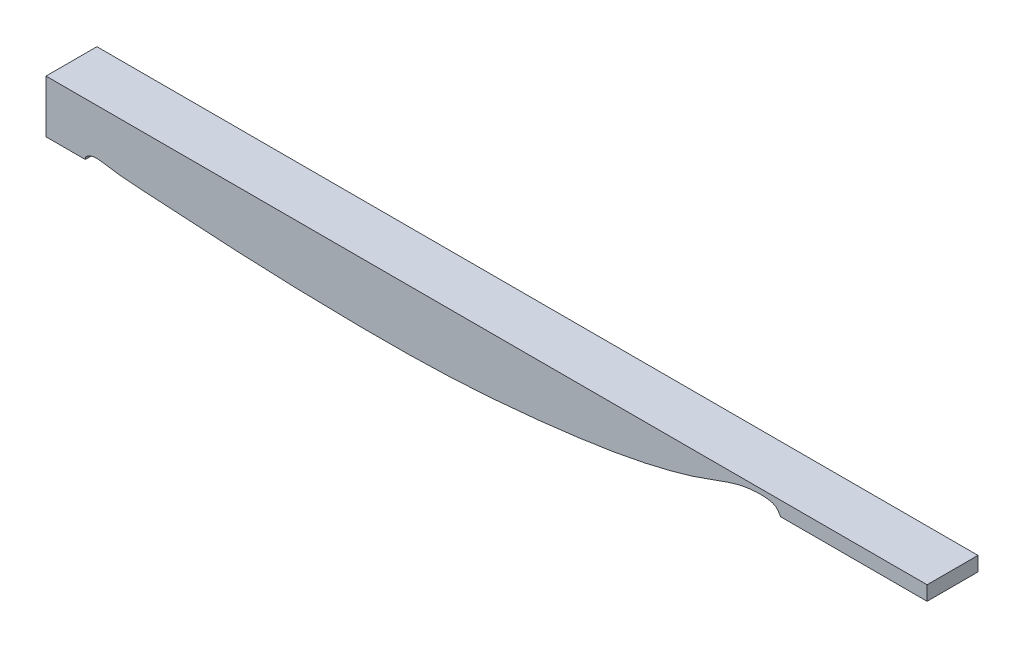
ISO-10303-21;
HEADER;
FILE_DESCRIPTION(('STEP AP214'),'2;1');
FILE_NAME('part.step','',(''),(''),'','','');
FILE_SCHEMA(('AUTOMOTIVE_DESIGN { 1 0 10303 214 1 1 1 1 }'));
ENDSEC;
DATA;
#1=APPLICATION_CONTEXT('core data for automotive mechanical design processes');
#2=APPLICATION_PROTOCOL_DEFINITION('international standard','automotive_design',2000,#1);
#3=PRODUCT_CONTEXT('',#1,'mechanical');
#4=PRODUCT('Part','Part','',(#3));
#5=PRODUCT_RELATED_PRODUCT_CATEGORY('part','',(#4));
#6=PRODUCT_DEFINITION_FORMATION('','',#4);
#7=PRODUCT_DEFINITION_CONTEXT('part definition',#1,'design');
#8=PRODUCT_DEFINITION('design','',#6,#7);
#9=PRODUCT_DEFINITION_SHAPE('','',#8);
#10=(LENGTH_UNIT() NAMED_UNIT(*) SI_UNIT(.MILLI.,.METRE.));
#11=(NAMED_UNIT(*) PLANE_ANGLE_UNIT() SI_UNIT($,.RADIAN.));
#12=(NAMED_UNIT(*) SI_UNIT($,.STERADIAN.) SOLID_ANGLE_UNIT());
#13=UNCERTAINTY_MEASURE_WITH_UNIT(LENGTH_MEASURE(1.E-05),#10,'distance_accuracy_value','');
#14=(GEOMETRIC_REPRESENTATION_CONTEXT(3) GLOBAL_UNCERTAINTY_ASSIGNED_CONTEXT((#13)) GLOBAL_UNIT_ASSIGNED_CONTEXT((#10,
#11,#12)) REPRESENTATION_CONTEXT('',''));
#15=CARTESIAN_POINT('',(0.,0.,0.));
#16=DIRECTION('',(0.,0.,1.));
#17=DIRECTION('',(1.,0.,0.));
#18=AXIS2_PLACEMENT_3D('',#15,#16,#17);
#19=CARTESIAN_POINT('',(-72.4217622520044,-6.0152528860404,492.));
#20=CARTESIAN_POINT('',(-72.4245340695074,-5.9419574405548,492.));
#21=CARTESIAN_POINT('',(-72.4264209550801,-5.86849221554323,492.));
#22=CARTESIAN_POINT('',(-72.4014484345056,-5.72434678750431,492.));
#23=CARTESIAN_POINT('',(-72.3745394573664,-5.65468478352478,492.));
#24=CARTESIAN_POINT('',(-72.2910639726507,-5.53221105076504,492.));
#25=CARTESIAN_POINT('',(-72.2346892942378,-5.48434236688133,492.));
#26=CARTESIAN_POINT('',(-72.1111212949632,-5.40440756269998,492.));
#27=CARTESIAN_POINT('',(-72.0465932612626,-5.36897528484742,492.));
#28=CARTESIAN_POINT('',(-71.854598746897,-5.26005130703209,492.));
#29=CARTESIAN_POINT('',(-71.724051366403,-5.19331466939612,492.));
#30=CARTESIAN_POINT('',(-71.4543296582812,-5.07982734814863,492.));
#31=CARTESIAN_POINT('',(-71.3122105257513,-5.03478950164715,492.));
#32=CARTESIAN_POINT('',(-70.8828234986377,-4.94984975591808,492.));
#33=CARTESIAN_POINT('',(-70.5960984017313,-4.9498880499188,492.));
#34=CARTESIAN_POINT('',(-70.0223188965501,-4.98991583819331,492.));
#35=CARTESIAN_POINT('',(-69.7348556998785,-5.02990828965604,492.));
#36=CARTESIAN_POINT('',(-69.1630808790653,-5.12321939807267,492.));
#37=CARTESIAN_POINT('',(-68.8782592831821,-5.17709029341441,492.));
#38=CARTESIAN_POINT('',(-68.3068091313997,-5.27259934318085,492.));
#39=CARTESIAN_POINT('',(-68.0204179730074,-5.31584462901445,492.));
#40=CARTESIAN_POINT('',(-67.1591286229369,-5.43125645656597,492.));
#41=CARTESIAN_POINT('',(-66.5818368718395,-5.48846860570867,492.));
#42=CARTESIAN_POINT('',(-65.4266985136911,-5.5830156976732,492.));
#43=CARTESIAN_POINT('',(-64.8485015239191,-5.62099238073446,492.));
#44=CARTESIAN_POINT('',(-63.6920746117483,-5.69645806781939,492.));
#45=CARTESIAN_POINT('',(-63.113887936377,-5.7345874905034,492.));
#46=CARTESIAN_POINT('',(-61.3791070923542,-5.84570580180726,492.));
#47=CARTESIAN_POINT('',(-60.2223035787287,-5.91559462931925,492.));
#48=CARTESIAN_POINT('',(-56.7518246475243,-6.12424836150641,492.));
#49=CARTESIAN_POINT('',(-54.4379833497714,-6.26043871454947,492.));
#50=CARTESIAN_POINT('',(-49.8094822127769,-6.51801853356771,492.));
#51=CARTESIAN_POINT('',(-47.4946815971044,-6.63755447555274,492.));
#52=CARTESIAN_POINT('',(-42.8635944178189,-6.84013750742366,492.));
#53=CARTESIAN_POINT('',(-40.5471259736763,-6.92366254378774,492.));
#54=CARTESIAN_POINT('',(-35.9135695608005,-7.05170215727384,492.));
#55=CARTESIAN_POINT('',(-33.596509431796,-7.09638295300983,492.));
#56=CARTESIAN_POINT('',(-28.9619520973505,-7.15576246070778,492.));
#57=CARTESIAN_POINT('',(-26.6444588078629,-7.17072979488286,492.));
#58=CARTESIAN_POINT('',(-22.0087638801482,-7.15207394339982,492.));
#59=CARTESIAN_POINT('',(-19.6913061972212,-7.11765540365621,492.));
#60=CARTESIAN_POINT('',(-15.0582313976797,-6.96755312195935,492.));
#61=CARTESIAN_POINT('',(-12.7432996489547,-6.85041466424149,492.));
#62=CARTESIAN_POINT('',(-8.12123285731955,-6.53520933522524,492.));
#63=CARTESIAN_POINT('',(-5.81322487028038,-6.33938113813548,492.));
#64=CARTESIAN_POINT('',(-1.2019211917164,-5.88818568034258,492.));
#65=CARTESIAN_POINT('',(1.10191710145064,-5.63235666258094,492.));
#66=CARTESIAN_POINT('',(5.69961502766229,-5.0493858193213,492.));
#67=CARTESIAN_POINT('',(7.99487576209379,-4.72380334110932,492.));
#68=CARTESIAN_POINT('',(11.423136267596,-4.15250706058942,492.));
#69=CARTESIAN_POINT('',(12.5632073579957,-3.94776266426388,492.));
#70=CARTESIAN_POINT('',(14.836341266982,-3.50088046240673,492.));
#71=CARTESIAN_POINT('',(15.9696675090794,-3.25806016741816,492.));
#72=CARTESIAN_POINT('',(18.2274484345349,-2.7346839421168,492.));
#73=CARTESIAN_POINT('',(19.3513767247218,-2.45516415681807,492.));
#74=CARTESIAN_POINT('',(21.5854278551139,-1.84651440785487,492.));
#75=CARTESIAN_POINT('',(22.6954179773851,-1.5169075194695,492.));
#76=CARTESIAN_POINT('',(24.3447899368817,-0.966390734433868,492.));
#77=CARTESIAN_POINT('',(24.8920239934532,-0.773677168587686,492.));
#78=CARTESIAN_POINT('',(25.983575205103,-0.378537214421157,492.));
#79=CARTESIAN_POINT('',(26.5275230015819,-0.174714314122803,492.));
#80=CARTESIAN_POINT('',(28.161663014074,0.428897655077978,492.));
#81=CARTESIAN_POINT('',(29.2548591175684,0.818410445544518,492.));
#82=CARTESIAN_POINT('',(30.9490466219192,1.21660035763408,492.));
#83=CARTESIAN_POINT('',(31.5233101668211,1.31671329085222,492.));
#84=CARTESIAN_POINT('',(32.6916562728048,1.44913843909731,492.));
#85=CARTESIAN_POINT('',(33.2825186784819,1.48267812700992,492.));
#86=CARTESIAN_POINT('',(34.1624821737295,1.46840272465559,492.));
#87=CARTESIAN_POINT('',(34.4555294847842,1.45334470995123,492.));
#88=CARTESIAN_POINT('',(34.8942287747826,1.39797425858455,492.));
#89=CARTESIAN_POINT('',(35.040500378108,1.37415878937688,492.));
#90=CARTESIAN_POINT('',(35.3319523256912,1.31379050654007,492.));
#91=CARTESIAN_POINT('',(35.4754991104092,1.27703119693708,492.));
#92=CARTESIAN_POINT('',(35.7547907564674,1.17997218878709,492.));
#93=CARTESIAN_POINT('',(35.8925878135417,1.11798020387173,492.));
#94=CARTESIAN_POINT('',(36.1415595906588,0.956820966047689,492.));
#95=CARTESIAN_POINT('',(36.2499148066927,0.855692868396349,492.));
#96=CARTESIAN_POINT('',(36.4466254523518,0.630516659071787,492.));
#97=CARTESIAN_POINT('',(36.5323595702494,0.508516224467772,492.));
#98=CARTESIAN_POINT('',(36.6664626506569,0.329618646071986,492.));
#99=CARTESIAN_POINT('',(36.7114348362996,0.270188338070849,492.));
#100=CARTESIAN_POINT('',(36.7904192551986,0.143154279947842,492.));
#101=CARTESIAN_POINT('',(36.8221023787594,0.074955100419384,492.));
#102=CARTESIAN_POINT('',(36.8321008981339,0.,492.));
#103=B_SPLINE_CURVE_WITH_KNOTS('',3,(#19,#20,#21,#22,#23,#24,#25,#26,#27,#28,#29,#30,#31,#32,
#33,#34,#35,#36,#37,#38,#39,#40,#41,#42,#43,#44,#45,#46,#47,#48,#49,#50,#51,#52,#53,#54,#55,#56,
#57,#58,#59,#60,#61,#62,#63,#64,#65,#66,#67,#68,#69,#70,#71,#72,#73,#74,#75,#76,#77,#78,#79,#80,
#81,#82,#83,#84,#85,#86,#87,#88,#89,#90,#91,#92,#93,#94,#95,#96,#97,#98,#99,#100,#101,#102),
.UNSPECIFIED.,.F.,.F.,(4,2,2,2,2,2,2,2,2,2,2,2,2,2,2,2,2,2,2,2,2,2,2,2,2,2,2,2,2,2,2,2,2,2,2,2,
2,2,2,2,2,4),(0.,0.00195312500000011,0.00390625000000033,0.00585937500000044,
0.00781250000000067,0.0117187500000007,0.0156250000000007,0.0234375000000007,0.0312500000000007,
0.0390625000000007,0.0468750000000007,0.0625000000000007,0.0781250000000007,0.0937500000000006,
0.125,0.1875,0.25,0.3125,0.375,0.4375,0.5,0.5625,0.625,0.6875,0.75,0.78125,0.8125,0.84375,0.875,
0.890625,0.90625,0.9375,0.953124999999999,0.968749999999999,0.976562499999999,0.980468749999999,
0.984375,0.98828125,0.9921875,0.99609375,0.998046875,1.),.UNSPECIFIED.);
#104=DIRECTION('',(0.,0.,-1.));
#105=VECTOR('',#104,1.);
#106=SURFACE_OF_LINEAR_EXTRUSION('',#103,#105);
#107=CARTESIAN_POINT('',(-72.4217622520044,-6.0152528860404,484.));
#108=CARTESIAN_POINT('',(-72.4245340695074,-5.9419574405548,484.));
#109=CARTESIAN_POINT('',(-72.4264209550801,-5.86849221554323,484.));
#110=CARTESIAN_POINT('',(-72.4014484345056,-5.72434678750431,484.));
#111=CARTESIAN_POINT('',(-72.3745394573664,-5.65468478352478,484.));
#112=CARTESIAN_POINT('',(-72.2910639726507,-5.53221105076504,484.));
#113=CARTESIAN_POINT('',(-72.2346892942378,-5.48434236688133,484.));
#114=CARTESIAN_POINT('',(-72.1111212949632,-5.40440756269998,484.));
#115=CARTESIAN_POINT('',(-72.0465932612626,-5.36897528484742,484.));
#116=CARTESIAN_POINT('',(-71.854598746897,-5.26005130703209,484.));
#117=CARTESIAN_POINT('',(-71.724051366403,-5.19331466939612,484.));
#118=CARTESIAN_POINT('',(-71.4543296582812,-5.07982734814863,484.));
#119=CARTESIAN_POINT('',(-71.3122105257513,-5.03478950164715,484.));
#120=CARTESIAN_POINT('',(-70.8828234986377,-4.94984975591808,484.));
#121=CARTESIAN_POINT('',(-70.5960984017313,-4.9498880499188,484.));
#122=CARTESIAN_POINT('',(-70.0223188965501,-4.98991583819331,484.));
#123=CARTESIAN_POINT('',(-69.7348556998785,-5.02990828965604,484.));
#124=CARTESIAN_POINT('',(-69.1630808790653,-5.12321939807267,484.));
#125=CARTESIAN_POINT('',(-68.8782592831821,-5.17709029341441,484.));
#126=CARTESIAN_POINT('',(-68.3068091313997,-5.27259934318085,484.));
#127=CARTESIAN_POINT('',(-68.0204179730074,-5.31584462901445,484.));
#128=CARTESIAN_POINT('',(-67.1591286229369,-5.43125645656597,484.));
#129=CARTESIAN_POINT('',(-66.5818368718395,-5.48846860570867,484.));
#130=CARTESIAN_POINT('',(-65.4266985136911,-5.5830156976732,484.));
#131=CARTESIAN_POINT('',(-64.8485015239191,-5.62099238073446,484.));
#132=CARTESIAN_POINT('',(-63.6920746117483,-5.69645806781939,484.));
#133=CARTESIAN_POINT('',(-63.113887936377,-5.7345874905034,484.));
#134=CARTESIAN_POINT('',(-61.3791070923542,-5.84570580180726,484.));
#135=CARTESIAN_POINT('',(-60.2223035787287,-5.91559462931925,484.));
#136=CARTESIAN_POINT('',(-56.7518246475243,-6.12424836150641,484.));
#137=CARTESIAN_POINT('',(-54.4379833497714,-6.26043871454947,484.));
#138=CARTESIAN_POINT('',(-49.8094822127769,-6.51801853356771,484.));
#139=CARTESIAN_POINT('',(-47.4946815971044,-6.63755447555274,484.));
#140=CARTESIAN_POINT('',(-42.8635944178189,-6.84013750742366,484.));
#141=CARTESIAN_POINT('',(-40.5471259736763,-6.92366254378774,484.));
#142=CARTESIAN_POINT('',(-35.9135695608005,-7.05170215727384,484.));
#143=CARTESIAN_POINT('',(-33.596509431796,-7.09638295300983,484.));
#144=CARTESIAN_POINT('',(-28.9619520973505,-7.15576246070778,484.));
#145=CARTESIAN_POINT('',(-26.6444588078629,-7.17072979488286,484.));
#146=CARTESIAN_POINT('',(-22.0087638801482,-7.15207394339982,484.));
#147=CARTESIAN_POINT('',(-19.6913061972212,-7.11765540365621,484.));
#148=CARTESIAN_POINT('',(-15.0582313976797,-6.96755312195935,484.));
#149=CARTESIAN_POINT('',(-12.7432996489547,-6.85041466424149,484.));
#150=CARTESIAN_POINT('',(-8.12123285731955,-6.53520933522524,484.));
#151=CARTESIAN_POINT('',(-5.81322487028038,-6.33938113813548,484.));
#152=CARTESIAN_POINT('',(-1.2019211917164,-5.88818568034258,484.));
#153=CARTESIAN_POINT('',(1.10191710145064,-5.63235666258094,484.));
#154=CARTESIAN_POINT('',(5.69961502766229,-5.0493858193213,484.));
#155=CARTESIAN_POINT('',(7.99487576209379,-4.72380334110932,484.));
#156=CARTESIAN_POINT('',(11.423136267596,-4.15250706058942,484.));
#157=CARTESIAN_POINT('',(12.5632073579957,-3.94776266426388,484.));
#158=CARTESIAN_POINT('',(14.836341266982,-3.50088046240673,484.));
#159=CARTESIAN_POINT('',(15.9696675090794,-3.25806016741816,484.));
#160=CARTESIAN_POINT('',(18.2274484345349,-2.7346839421168,484.));
#161=CARTESIAN_POINT('',(19.3513767247218,-2.45516415681807,484.));
#162=CARTESIAN_POINT('',(21.5854278551139,-1.84651440785487,484.));
#163=CARTESIAN_POINT('',(22.6954179773851,-1.5169075194695,484.));
#164=CARTESIAN_POINT('',(24.3447899368817,-0.966390734433868,484.));
#165=CARTESIAN_POINT('',(24.8920239934532,-0.773677168587686,484.));
#166=CARTESIAN_POINT('',(25.983575205103,-0.378537214421157,484.));
#167=CARTESIAN_POINT('',(26.5275230015819,-0.174714314122803,484.));
#168=CARTESIAN_POINT('',(28.161663014074,0.428897655077978,484.));
#169=CARTESIAN_POINT('',(29.2548591175684,0.818410445544518,484.));
#170=CARTESIAN_POINT('',(30.9490466219192,1.21660035763408,484.));
#171=CARTESIAN_POINT('',(31.5233101668211,1.31671329085222,484.));
#172=CARTESIAN_POINT('',(32.6916562728048,1.44913843909731,484.));
#173=CARTESIAN_POINT('',(33.2825186784819,1.48267812700992,484.));
#174=CARTESIAN_POINT('',(34.1624821737295,1.46840272465559,484.));
#175=CARTESIAN_POINT('',(34.4555294847842,1.45334470995123,484.));
#176=CARTESIAN_POINT('',(34.8942287747826,1.39797425858455,484.));
#177=CARTESIAN_POINT('',(35.040500378108,1.37415878937688,484.));
#178=CARTESIAN_POINT('',(35.3319523256912,1.31379050654007,484.));
#179=CARTESIAN_POINT('',(35.4754991104092,1.27703119693708,484.));
#180=CARTESIAN_POINT('',(35.7547907564674,1.17997218878709,484.));
#181=CARTESIAN_POINT('',(35.8925878135417,1.11798020387173,484.));
#182=CARTESIAN_POINT('',(36.1415595906588,0.956820966047689,484.));
#183=CARTESIAN_POINT('',(36.2499148066927,0.855692868396349,484.));
#184=CARTESIAN_POINT('',(36.4466254523518,0.630516659071787,484.));
#185=CARTESIAN_POINT('',(36.5323595702494,0.508516224467772,484.));
#186=CARTESIAN_POINT('',(36.6664626506569,0.329618646071986,484.));
#187=CARTESIAN_POINT('',(36.7114348362996,0.270188338070849,484.));
#188=CARTESIAN_POINT('',(36.7904192551986,0.143154279947842,484.));
#189=CARTESIAN_POINT('',(36.8221023787594,0.074955100419384,484.));
#190=CARTESIAN_POINT('',(36.8321008981339,0.,484.));
#191=B_SPLINE_CURVE_WITH_KNOTS('',3,(#107,#108,#109,#110,#111,#112,#113,#114,#115,#116,#117,
#118,#119,#120,#121,#122,#123,#124,#125,#126,#127,#128,#129,#130,#131,#132,#133,#134,#135,#136,
#137,#138,#139,#140,#141,#142,#143,#144,#145,#146,#147,#148,#149,#150,#151,#152,#153,#154,#155,
#156,#157,#158,#159,#160,#161,#162,#163,#164,#165,#166,#167,#168,#169,#170,#171,#172,#173,#174,
#175,#176,#177,#178,#179,#180,#181,#182,#183,#184,#185,#186,#187,#188,#189,#190),.UNSPECIFIED.,
.F.,.F.,(4,2,2,2,2,2,2,2,2,2,2,2,2,2,2,2,2,2,2,2,2,2,2,2,2,2,2,2,2,2,2,2,2,2,2,2,2,2,2,2,2,4),
(0.,0.00195312500000011,0.00390625000000033,0.00585937500000044,0.00781250000000067,
0.0117187500000007,0.0156250000000007,0.0234375000000007,0.0312500000000007,0.0390625000000007,
0.0468750000000007,0.0625000000000007,0.0781250000000007,0.0937500000000006,0.125,0.1875,0.25,
0.3125,0.375,0.4375,0.5,0.5625,0.625,0.6875,0.75,0.78125,0.8125,0.84375,0.875,0.890625,0.90625,
0.9375,0.953124999999999,0.968749999999999,0.976562499999999,0.980468749999999,0.984375,
0.98828125,0.9921875,0.99609375,0.998046875,1.),.UNSPECIFIED.);
#192=CARTESIAN_POINT('',(-72.4217622520043,-6.01525288604037,484.));
#193=VERTEX_POINT('',#192);
#194=CARTESIAN_POINT('',(36.8321008981339,0.,484.));
#195=VERTEX_POINT('',#194);
#196=EDGE_CURVE('E165',#193,#195,#191,.T.);
#197=ORIENTED_EDGE('',*,*,#196,.T.);
#198=DIRECTION('',(0.,0.,-1.));
#199=VECTOR('',#198,1.);
#200=CARTESIAN_POINT('',(36.8321008981339,0.,492.));
#201=LINE('',#200,#199);
#202=CARTESIAN_POINT('',(36.8321008981339,0.,492.));
#203=VERTEX_POINT('',#202);
#204=EDGE_CURVE('E11',#203,#195,#201,.T.);
#205=ORIENTED_EDGE('',*,*,#204,.F.);
#206=CARTESIAN_POINT('',(36.8321008981339,0.,492.));
#207=CARTESIAN_POINT('',(36.8221023787594,0.074955100419384,492.));
#208=CARTESIAN_POINT('',(36.7904192551986,0.143154279947842,492.));
#209=CARTESIAN_POINT('',(36.7114348362996,0.270188338070849,492.));
#210=CARTESIAN_POINT('',(36.6664626506569,0.329618646071986,492.));
#211=CARTESIAN_POINT('',(36.5323595702494,0.508516224467772,492.));
#212=CARTESIAN_POINT('',(36.4466254523518,0.630516659071787,492.));
#213=CARTESIAN_POINT('',(36.2499148066927,0.855692868396349,492.));
#214=CARTESIAN_POINT('',(36.1415595906588,0.956820966047689,492.));
#215=CARTESIAN_POINT('',(35.8925878135417,1.11798020387173,492.));
#216=CARTESIAN_POINT('',(35.7547907564674,1.17997218878709,492.));
#217=CARTESIAN_POINT('',(35.4754991104092,1.27703119693708,492.));
#218=CARTESIAN_POINT('',(35.3319523256912,1.31379050654007,492.));
#219=CARTESIAN_POINT('',(35.040500378108,1.37415878937688,492.));
#220=CARTESIAN_POINT('',(34.8942287747826,1.39797425858455,492.));
#221=CARTESIAN_POINT('',(34.4555294847842,1.45334470995123,492.));
#222=CARTESIAN_POINT('',(34.1624821737295,1.46840272465559,492.));
#223=CARTESIAN_POINT('',(33.2825186784819,1.48267812700992,492.));
#224=CARTESIAN_POINT('',(32.6916562728048,1.44913843909731,492.));
#225=CARTESIAN_POINT('',(31.5233101668211,1.31671329085222,492.));
#226=CARTESIAN_POINT('',(30.9490466219192,1.21660035763408,492.));
#227=CARTESIAN_POINT('',(29.2548591175684,0.818410445544518,492.));
#228=CARTESIAN_POINT('',(28.161663014074,0.428897655077978,492.));
#229=CARTESIAN_POINT('',(26.5275230015819,-0.174714314122803,492.));
#230=CARTESIAN_POINT('',(25.983575205103,-0.378537214421157,492.));
#231=CARTESIAN_POINT('',(24.8920239934532,-0.773677168587686,492.));
#232=CARTESIAN_POINT('',(24.3447899368817,-0.966390734433868,492.));
#233=CARTESIAN_POINT('',(22.6954179773851,-1.5169075194695,492.));
#234=CARTESIAN_POINT('',(21.5854278551139,-1.84651440785487,492.));
#235=CARTESIAN_POINT('',(19.3513767247218,-2.45516415681807,492.));
#236=CARTESIAN_POINT('',(18.2274484345349,-2.7346839421168,492.));
#237=CARTESIAN_POINT('',(15.9696675090794,-3.25806016741816,492.));
#238=CARTESIAN_POINT('',(14.836341266982,-3.50088046240673,492.));
#239=CARTESIAN_POINT('',(12.5632073579957,-3.94776266426388,492.));
#240=CARTESIAN_POINT('',(11.423136267596,-4.15250706058942,492.));
#241=CARTESIAN_POINT('',(7.99487576209379,-4.72380334110932,492.));
#242=CARTESIAN_POINT('',(5.69961502766229,-5.0493858193213,492.));
#243=CARTESIAN_POINT('',(1.10191710145064,-5.63235666258094,492.));
#244=CARTESIAN_POINT('',(-1.2019211917164,-5.88818568034258,492.));
#245=CARTESIAN_POINT('',(-5.81322487028038,-6.33938113813548,492.));
#246=CARTESIAN_POINT('',(-8.12123285731955,-6.53520933522524,492.));
#247=CARTESIAN_POINT('',(-12.7432996489547,-6.85041466424149,492.));
#248=CARTESIAN_POINT('',(-15.0582313976797,-6.96755312195935,492.));
#249=CARTESIAN_POINT('',(-19.6913061972212,-7.11765540365621,492.));
#250=CARTESIAN_POINT('',(-22.0087638801482,-7.15207394339982,492.));
#251=CARTESIAN_POINT('',(-26.6444588078629,-7.17072979488286,492.));
#252=CARTESIAN_POINT('',(-28.9619520973505,-7.15576246070778,492.));
#253=CARTESIAN_POINT('',(-33.596509431796,-7.09638295300983,492.));
#254=CARTESIAN_POINT('',(-35.9135695608005,-7.05170215727384,492.));
#255=CARTESIAN_POINT('',(-40.5471259736763,-6.92366254378774,492.));
#256=CARTESIAN_POINT('',(-42.8635944178189,-6.84013750742366,492.));
#257=CARTESIAN_POINT('',(-47.4946815971044,-6.63755447555274,492.));
#258=CARTESIAN_POINT('',(-49.8094822127769,-6.51801853356771,492.));
#259=CARTESIAN_POINT('',(-54.4379833497714,-6.26043871454947,492.));
#260=CARTESIAN_POINT('',(-56.7518246475243,-6.12424836150641,492.));
#261=CARTESIAN_POINT('',(-60.2223035787287,-5.91559462931925,492.));
#262=CARTESIAN_POINT('',(-61.3791070923542,-5.84570580180726,492.));
#263=CARTESIAN_POINT('',(-63.113887936377,-5.7345874905034,492.));
#264=CARTESIAN_POINT('',(-63.6920746117483,-5.69645806781939,492.));
#265=CARTESIAN_POINT('',(-64.8485015239191,-5.62099238073446,492.));
#266=CARTESIAN_POINT('',(-65.4266985136911,-5.5830156976732,492.));
#267=CARTESIAN_POINT('',(-66.5818368718395,-5.48846860570867,492.));
#268=CARTESIAN_POINT('',(-67.1591286229369,-5.43125645656597,492.));
#269=CARTESIAN_POINT('',(-68.0204179730074,-5.31584462901445,492.));
#270=CARTESIAN_POINT('',(-68.3068091313997,-5.27259934318085,492.));
#271=CARTESIAN_POINT('',(-68.8782592831821,-5.17709029341441,492.));
#272=CARTESIAN_POINT('',(-69.1630808790653,-5.12321939807267,492.));
#273=CARTESIAN_POINT('',(-69.7348556998785,-5.02990828965604,492.));
#274=CARTESIAN_POINT('',(-70.0223188965501,-4.98991583819331,492.));
#275=CARTESIAN_POINT('',(-70.5960984017313,-4.9498880499188,492.));
#276=CARTESIAN_POINT('',(-70.8828234986377,-4.94984975591808,492.));
#277=CARTESIAN_POINT('',(-71.3122105257513,-5.03478950164715,492.));
#278=CARTESIAN_POINT('',(-71.4543296582812,-5.07982734814863,492.));
#279=CARTESIAN_POINT('',(-71.724051366403,-5.19331466939612,492.));
#280=CARTESIAN_POINT('',(-71.854598746897,-5.26005130703209,492.));
#281=CARTESIAN_POINT('',(-72.0465932612626,-5.36897528484742,492.));
#282=CARTESIAN_POINT('',(-72.1111212949632,-5.40440756269998,492.));
#283=CARTESIAN_POINT('',(-72.2346892942378,-5.48434236688133,492.));
#284=CARTESIAN_POINT('',(-72.2910639726507,-5.53221105076504,492.));
#285=CARTESIAN_POINT('',(-72.3745394573664,-5.65468478352478,492.));
#286=CARTESIAN_POINT('',(-72.4014484345056,-5.72434678750431,492.));
#287=CARTESIAN_POINT('',(-72.4264209550801,-5.86849221554323,492.));
#288=CARTESIAN_POINT('',(-72.4245340695074,-5.9419574405548,492.));
#289=CARTESIAN_POINT('',(-72.4217622520044,-6.0152528860404,492.));
#290=B_SPLINE_CURVE_WITH_KNOTS('',3,(#206,#207,#208,#209,#210,#211,#212,#213,#214,#215,#216,
#217,#218,#219,#220,#221,#222,#223,#224,#225,#226,#227,#228,#229,#230,#231,#232,#233,#234,#235,
#236,#237,#238,#239,#240,#241,#242,#243,#244,#245,#246,#247,#248,#249,#250,#251,#252,#253,#254,
#255,#256,#257,#258,#259,#260,#261,#262,#263,#264,#265,#266,#267,#268,#269,#270,#271,#272,#273,
#274,#275,#276,#277,#278,#279,#280,#281,#282,#283,#284,#285,#286,#287,#288,#289),.UNSPECIFIED.,
.F.,.F.,(4,2,2,2,2,2,2,2,2,2,2,2,2,2,2,2,2,2,2,2,2,2,2,2,2,2,2,2,2,2,2,2,2,2,2,2,2,2,2,2,2,4),
(0.,0.001953125,0.00390625000000011,0.00781250000000022,0.0117187500000003,0.0156250000000004,
0.0195312500000006,0.0234375000000007,0.0312500000000007,0.0468750000000006,0.0625000000000004,
0.0937500000000003,0.109375,0.125,0.15625,0.1875,0.21875,0.25,0.3125,0.375,0.4375,0.5,0.5625,
0.625,0.6875,0.75,0.8125,0.875,0.906249999999999,0.921874999999999,0.937499999999999,
0.953124999999999,0.960937499999999,0.968749999999999,0.976562499999999,0.984374999999999,
0.988281249999999,0.992187499999999,0.994140625,0.99609375,0.998046875,1.),.UNSPECIFIED.);
#291=CARTESIAN_POINT('',(-72.4217622520043,-6.01525288604037,492.));
#292=VERTEX_POINT('',#291);
#293=EDGE_CURVE('E129',#292,#203,#290,.F.);
#294=ORIENTED_EDGE('',*,*,#293,.F.);
#295=DIRECTION('',(0.,0.,-1.));
#296=VECTOR('',#295,1.);
#297=CARTESIAN_POINT('',(-72.4217622520043,-6.01525288604037,492.));
#298=LINE('',#297,#296);
#299=EDGE_CURVE('E114',#292,#193,#298,.T.);
#300=ORIENTED_EDGE('',*,*,#299,.T.);
#301=EDGE_LOOP('',(#197,#205,#294,#300));
#302=FACE_BOUND('',#301,.T.);
#303=ADVANCED_FACE('F30',(#302),#106,.F.);
#304=CARTESIAN_POINT('',(36.8321008981339,0.,492.));
#305=DIRECTION('',(0.,1.,0.));
#306=DIRECTION('',(-1.,0.,0.));
#307=AXIS2_PLACEMENT_3D('',#304,#305,#306);
#308=PLANE('',#307);
#309=DIRECTION('',(1.,0.,0.));
#310=VECTOR('',#309,1.);
#311=CARTESIAN_POINT('',(36.8321008981339,0.,484.));
#312=LINE('',#311,#310);
#313=CARTESIAN_POINT('',(59.8821217939633,0.,484.));
#314=VERTEX_POINT('',#313);
#315=EDGE_CURVE('E120',#195,#314,#312,.T.);
#316=ORIENTED_EDGE('',*,*,#315,.T.);
#317=DIRECTION('',(0.,0.,-1.));
#318=VECTOR('',#317,1.);
#319=CARTESIAN_POINT('',(59.8821217939633,0.,492.));
#320=LINE('',#319,#318);
#321=CARTESIAN_POINT('',(59.8821217939633,0.,492.));
#322=VERTEX_POINT('',#321);
#323=EDGE_CURVE('E41',#322,#314,#320,.T.);
#324=ORIENTED_EDGE('',*,*,#323,.F.);
#325=DIRECTION('',(1.,0.,0.));
#326=VECTOR('',#325,1.);
#327=CARTESIAN_POINT('',(36.8321008981339,0.,492.));
#328=LINE('',#327,#326);
#329=EDGE_CURVE('E87',#203,#322,#328,.T.);
#330=ORIENTED_EDGE('',*,*,#329,.F.);
#331=ORIENTED_EDGE('',*,*,#204,.T.);
#332=EDGE_LOOP('',(#316,#324,#330,#331));
#333=FACE_BOUND('',#332,.T.);
#334=ADVANCED_FACE('F199',(#333),#308,.F.);
#335=CARTESIAN_POINT('',(59.8821217939633,2.25600000000005,492.));
#336=DIRECTION('',(-1.,0.,0.));
#337=DIRECTION('',(0.,-1.,0.));
#338=AXIS2_PLACEMENT_3D('',#335,#336,#337);
#339=PLANE('',#338);
#340=DIRECTION('',(0.,1.,0.));
#341=VECTOR('',#340,1.);
#342=CARTESIAN_POINT('',(59.8821217939633,2.25600000000005,484.));
#343=LINE('',#342,#341);
#344=CARTESIAN_POINT('',(59.8821217939633,2.25600000000005,484.));
#345=VERTEX_POINT('',#344);
#346=EDGE_CURVE('E118',#314,#345,#343,.T.);
#347=ORIENTED_EDGE('',*,*,#346,.T.);
#348=DIRECTION('',(0.,0.,-1.));
#349=VECTOR('',#348,1.);
#350=CARTESIAN_POINT('',(59.8821217939633,2.25600000000005,492.));
#351=LINE('',#350,#349);
#352=CARTESIAN_POINT('',(59.8821217939633,2.25600000000005,492.));
#353=VERTEX_POINT('',#352);
#354=EDGE_CURVE('E109',#353,#345,#351,.T.);
#355=ORIENTED_EDGE('',*,*,#354,.F.);
#356=DIRECTION('',(0.,1.,0.));
#357=VECTOR('',#356,1.);
#358=CARTESIAN_POINT('',(59.8821217939633,2.25600000000005,492.));
#359=LINE('',#358,#357);
#360=EDGE_CURVE('E100',#322,#353,#359,.T.);
#361=ORIENTED_EDGE('',*,*,#360,.F.);
#362=ORIENTED_EDGE('',*,*,#323,.T.);
#363=EDGE_LOOP('',(#347,#355,#361,#362));
#364=FACE_BOUND('',#363,.T.);
#365=ADVANCED_FACE('F202',(#364),#339,.F.);
#366=CARTESIAN_POINT('',(59.8821217939633,2.25600000000005,492.));
#367=DIRECTION('',(0.,-1.,0.));
#368=DIRECTION('',(1.,0.,0.));
#369=AXIS2_PLACEMENT_3D('',#366,#367,#368);
#370=PLANE('',#369);
#371=DIRECTION('',(-1.,0.,0.));
#372=VECTOR('',#371,1.);
#373=CARTESIAN_POINT('',(59.8821217939633,2.25600000000005,484.));
#374=LINE('',#373,#372);
#375=CARTESIAN_POINT('',(-78.5977461885902,2.25600000000004,484.));
#376=VERTEX_POINT('',#375);
#377=EDGE_CURVE('E108',#345,#376,#374,.T.);
#378=ORIENTED_EDGE('',*,*,#377,.T.);
#379=DIRECTION('',(0.,0.,-1.));
#380=VECTOR('',#379,1.);
#381=CARTESIAN_POINT('',(-78.5977461885902,2.25600000000004,492.));
#382=LINE('',#381,#380);
#383=CARTESIAN_POINT('',(-78.5977461885902,2.25600000000004,492.));
#384=VERTEX_POINT('',#383);
#385=EDGE_CURVE('E105',#384,#376,#382,.T.);
#386=ORIENTED_EDGE('',*,*,#385,.F.);
#387=DIRECTION('',(-1.,0.,0.));
#388=VECTOR('',#387,1.);
#389=CARTESIAN_POINT('',(59.8821217939633,2.25600000000005,492.));
#390=LINE('',#389,#388);
#391=EDGE_CURVE('E94',#353,#384,#390,.T.);
#392=ORIENTED_EDGE('',*,*,#391,.F.);
#393=ORIENTED_EDGE('',*,*,#354,.T.);
#394=EDGE_LOOP('',(#378,#386,#392,#393));
#395=FACE_BOUND('',#394,.T.);
#396=ADVANCED_FACE('F106',(#395),#370,.F.);
#397=CARTESIAN_POINT('',(-78.5977461885902,-6.01525558540376,492.));
#398=DIRECTION('',(1.,0.,0.));
#399=DIRECTION('',(0.,1.,0.));
#400=AXIS2_PLACEMENT_3D('',#397,#398,#399);
#401=PLANE('',#400);
#402=DIRECTION('',(0.,-1.,0.));
#403=VECTOR('',#402,1.);
#404=CARTESIAN_POINT('',(-78.5977461885902,-6.01525558540376,484.));
#405=LINE('',#404,#403);
#406=CARTESIAN_POINT('',(-78.5977461885902,-6.01525558540376,484.));
#407=VERTEX_POINT('',#406);
#408=EDGE_CURVE('E73',#376,#407,#405,.T.);
#409=ORIENTED_EDGE('',*,*,#408,.T.);
#410=DIRECTION('',(0.,0.,-1.));
#411=VECTOR('',#410,1.);
#412=CARTESIAN_POINT('',(-78.5977461885902,-6.01525558540376,492.));
#413=LINE('',#412,#411);
#414=CARTESIAN_POINT('',(-78.5977461885902,-6.01525558540376,492.));
#415=VERTEX_POINT('',#414);
#416=EDGE_CURVE('E110',#415,#407,#413,.T.);
#417=ORIENTED_EDGE('',*,*,#416,.F.);
#418=DIRECTION('',(0.,-1.,0.));
#419=VECTOR('',#418,1.);
#420=CARTESIAN_POINT('',(-78.5977461885902,-6.01525558540376,492.));
#421=LINE('',#420,#419);
#422=EDGE_CURVE('E98',#384,#415,#421,.T.);
#423=ORIENTED_EDGE('',*,*,#422,.F.);
#424=ORIENTED_EDGE('',*,*,#385,.T.);
#425=EDGE_LOOP('',(#409,#417,#423,#424));
#426=FACE_BOUND('',#425,.T.);
#427=ADVANCED_FACE('F112',(#426),#401,.F.);
#428=CARTESIAN_POINT('',(-78.5977461885902,-6.01525558540376,492.));
#429=DIRECTION('',(-4.37074224271432E-07,0.999999999999905,0.));
#430=DIRECTION('',(-0.999999999999905,-4.37074224271432E-07,0.));
#431=AXIS2_PLACEMENT_3D('',#428,#429,#430);
#432=PLANE('',#431);
#433=DIRECTION('',(0.999999999999905,4.37074224271432E-07,0.));
#434=VECTOR('',#433,1.);
#435=CARTESIAN_POINT('',(-78.5977461885902,-6.01525558540376,484.));
#436=LINE('',#435,#434);
#437=EDGE_CURVE('E79',#407,#193,#436,.T.);
#438=ORIENTED_EDGE('',*,*,#437,.T.);
#439=ORIENTED_EDGE('',*,*,#299,.F.);
#440=DIRECTION('',(0.999999999999905,4.37074224271432E-07,0.));
#441=VECTOR('',#440,1.);
#442=CARTESIAN_POINT('',(-78.5977461885902,-6.01525558540376,492.));
#443=LINE('',#442,#441);
#444=EDGE_CURVE('E50',#415,#292,#443,.T.);
#445=ORIENTED_EDGE('',*,*,#444,.F.);
#446=ORIENTED_EDGE('',*,*,#416,.T.);
#447=EDGE_LOOP('',(#438,#439,#445,#446));
#448=FACE_BOUND('',#447,.T.);
#449=ADVANCED_FACE('F145',(#448),#432,.F.);
#450=CARTESIAN_POINT('',(-17.3747687974504,-7.04260426280778,492.));
#451=DIRECTION('',(0.,0.,-1.));
#452=DIRECTION('',(-1.,0.,0.));
#453=AXIS2_PLACEMENT_3D('',#450,#451,#452);
#454=PLANE('',#453);
#455=ORIENTED_EDGE('',*,*,#293,.T.);
#456=ORIENTED_EDGE('',*,*,#329,.T.);
#457=ORIENTED_EDGE('',*,*,#360,.T.);
#458=ORIENTED_EDGE('',*,*,#391,.T.);
#459=ORIENTED_EDGE('',*,*,#422,.T.);
#460=ORIENTED_EDGE('',*,*,#444,.T.);
#461=EDGE_LOOP('',(#455,#456,#457,#458,#459,#460));
#462=FACE_BOUND('',#461,.T.);
#463=ADVANCED_FACE('F96',(#462),#454,.F.);
#464=CARTESIAN_POINT('',(-17.3747687974504,-7.04260426280778,484.));
#465=DIRECTION('',(0.,0.,-1.));
#466=DIRECTION('',(-1.,0.,0.));
#467=AXIS2_PLACEMENT_3D('',#464,#465,#466);
#468=PLANE('',#467);
#469=ORIENTED_EDGE('',*,*,#196,.F.);
#470=ORIENTED_EDGE('',*,*,#437,.F.);
#471=ORIENTED_EDGE('',*,*,#408,.F.);
#472=ORIENTED_EDGE('',*,*,#377,.F.);
#473=ORIENTED_EDGE('',*,*,#346,.F.);
#474=ORIENTED_EDGE('',*,*,#315,.F.);
#475=EDGE_LOOP('',(#469,#470,#471,#472,#473,#474));
#476=FACE_BOUND('',#475,.T.);
#477=ADVANCED_FACE('F144',(#476),#468,.T.);
#478=CLOSED_SHELL('',(#303,#334,#365,#396,#427,#449,#463,#477));
#479=MANIFOLD_SOLID_BREP('B2',#478);
#480=ADVANCED_BREP_SHAPE_REPRESENTATION('',(#18,#479),#14);
#481=SHAPE_DEFINITION_REPRESENTATION(#9,#480);
ENDSEC;
END-ISO-10303-21;
